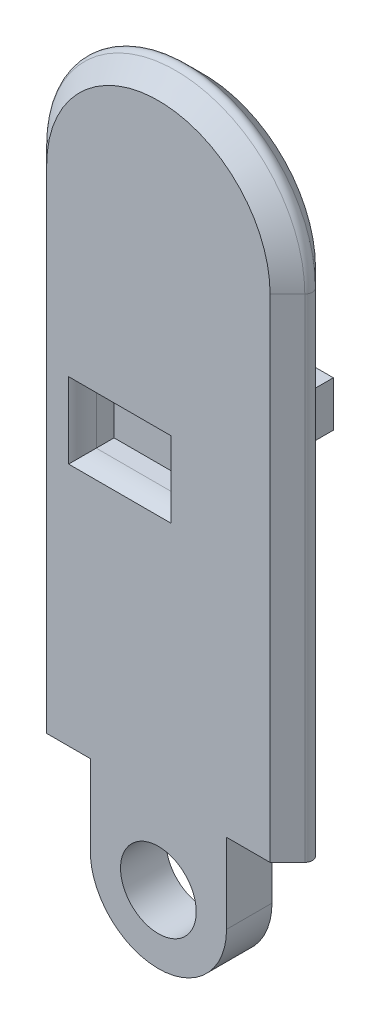
ISO-10303-21;
HEADER;
FILE_DESCRIPTION(('STEP AP214'),'2;1');
FILE_NAME('part.step','',(''),(''),'','','');
FILE_SCHEMA(('AUTOMOTIVE_DESIGN { 1 0 10303 214 1 1 1 1 }'));
ENDSEC;
DATA;
#1=APPLICATION_CONTEXT('core data for automotive mechanical design processes');
#2=APPLICATION_PROTOCOL_DEFINITION('international standard','automotive_design',2000,#1);
#3=PRODUCT_CONTEXT('',#1,'mechanical');
#4=PRODUCT('Part','Part','',(#3));
#5=PRODUCT_RELATED_PRODUCT_CATEGORY('part','',(#4));
#6=PRODUCT_DEFINITION_FORMATION('','',#4);
#7=PRODUCT_DEFINITION_CONTEXT('part definition',#1,'design');
#8=PRODUCT_DEFINITION('design','',#6,#7);
#9=PRODUCT_DEFINITION_SHAPE('','',#8);
#10=(LENGTH_UNIT() NAMED_UNIT(*) SI_UNIT(.MILLI.,.METRE.));
#11=(NAMED_UNIT(*) PLANE_ANGLE_UNIT() SI_UNIT($,.RADIAN.));
#12=(NAMED_UNIT(*) SI_UNIT($,.STERADIAN.) SOLID_ANGLE_UNIT());
#13=UNCERTAINTY_MEASURE_WITH_UNIT(LENGTH_MEASURE(1.E-05),#10,'distance_accuracy_value','');
#14=(GEOMETRIC_REPRESENTATION_CONTEXT(3) GLOBAL_UNCERTAINTY_ASSIGNED_CONTEXT((#13)) GLOBAL_UNIT_ASSIGNED_CONTEXT((#10,
#11,#12)) REPRESENTATION_CONTEXT('',''));
#15=CARTESIAN_POINT('',(0.,0.,0.));
#16=DIRECTION('',(0.,0.,1.));
#17=DIRECTION('',(1.,0.,0.));
#18=AXIS2_PLACEMENT_3D('',#15,#16,#17);
#19=CARTESIAN_POINT('',(0.,0.,-6.));
#20=DIRECTION('',(0.,0.,1.));
#21=DIRECTION('',(1.,0.,0.));
#22=AXIS2_PLACEMENT_3D('',#19,#20,#21);
#23=PLANE('',#22);
#24=CARTESIAN_POINT('',(0.,-43.030823628885,-6.));
#25=DIRECTION('',(0.,0.,1.));
#26=DIRECTION('',(1.,0.,0.));
#27=AXIS2_PLACEMENT_3D('',#24,#25,#26);
#28=CIRCLE('',#27,5.);
#29=CARTESIAN_POINT('',(5.,-43.030823628885,-6.));
#30=VERTEX_POINT('',#29);
#31=EDGE_CURVE('E267',#30,#30,#28,.T.);
#32=ORIENTED_EDGE('',*,*,#31,.T.);
#33=EDGE_LOOP('',(#32));
#34=FACE_BOUND('',#33,.T.);
#35=CARTESIAN_POINT('',(0.,32.5,-6.));
#36=DIRECTION('',(0.,0.,1.));
#37=DIRECTION('',(1.,0.,0.));
#38=AXIS2_PLACEMENT_3D('',#35,#36,#37);
#39=CIRCLE('',#38,14.75);
#40=CARTESIAN_POINT('',(-14.75,32.5,-6.));
#41=VERTEX_POINT('',#40);
#42=CARTESIAN_POINT('',(14.75,32.5,-6.));
#43=VERTEX_POINT('',#42);
#44=EDGE_CURVE('E348',#41,#43,#39,.F.);
#45=ORIENTED_EDGE('',*,*,#44,.T.);
#46=DIRECTION('',(0.,-1.,0.));
#47=VECTOR('',#46,1.);
#48=CARTESIAN_POINT('',(14.75,0.,-6.));
#49=LINE('',#48,#47);
#50=CARTESIAN_POINT('',(14.75,-32.5,-6.));
#51=VERTEX_POINT('',#50);
#52=EDGE_CURVE('E350',#43,#51,#49,.T.);
#53=ORIENTED_EDGE('',*,*,#52,.T.);
#54=DIRECTION('',(1.,0.,0.));
#55=VECTOR('',#54,1.);
#56=CARTESIAN_POINT('',(0.,-32.5,-6.));
#57=LINE('',#56,#55);
#58=CARTESIAN_POINT('',(9.,-32.5,-6.));
#59=VERTEX_POINT('',#58);
#60=EDGE_CURVE('E342',#59,#51,#57,.T.);
#61=ORIENTED_EDGE('',*,*,#60,.F.);
#62=DIRECTION('',(0.,1.,0.));
#63=VECTOR('',#62,1.);
#64=CARTESIAN_POINT('',(8.99999999999999,0.,-6.));
#65=LINE('',#64,#63);
#66=CARTESIAN_POINT('',(9.00000000000001,-43.030823628885,-6.));
#67=VERTEX_POINT('',#66);
#68=EDGE_CURVE('E265',#67,#59,#65,.T.);
#69=ORIENTED_EDGE('',*,*,#68,.F.);
#70=CARTESIAN_POINT('',(0.,-43.030823628885,-6.));
#71=DIRECTION('',(0.,0.,1.));
#72=DIRECTION('',(1.,0.,0.));
#73=AXIS2_PLACEMENT_3D('',#70,#71,#72);
#74=CIRCLE('',#73,9.);
#75=CARTESIAN_POINT('',(-8.97468464942043,-43.7053867789735,-6.));
#76=VERTEX_POINT('',#75);
#77=EDGE_CURVE('E261',#76,#67,#74,.T.);
#78=ORIENTED_EDGE('',*,*,#77,.F.);
#79=DIRECTION('',(0.,-1.,0.));
#80=VECTOR('',#79,1.);
#81=CARTESIAN_POINT('',(-8.97468464942044,0.,-6.));
#82=LINE('',#81,#80);
#83=CARTESIAN_POINT('',(-8.97468464942043,-32.5,-6.));
#84=VERTEX_POINT('',#83);
#85=EDGE_CURVE('E258',#84,#76,#82,.T.);
#86=ORIENTED_EDGE('',*,*,#85,.F.);
#87=CARTESIAN_POINT('',(-14.75,-32.5,-6.));
#88=VERTEX_POINT('',#87);
#89=EDGE_CURVE('E338',#88,#84,#57,.T.);
#90=ORIENTED_EDGE('',*,*,#89,.F.);
#91=DIRECTION('',(0.,1.,0.));
#92=VECTOR('',#91,1.);
#93=CARTESIAN_POINT('',(-14.75,32.5,-6.));
#94=LINE('',#93,#92);
#95=EDGE_CURVE('E341',#88,#41,#94,.T.);
#96=ORIENTED_EDGE('',*,*,#95,.T.);
#97=EDGE_LOOP('',(#45,#53,#61,#69,#78,#86,#90,#96));
#98=FACE_BOUND('',#97,.T.);
#99=DIRECTION('',(0.,-1.,0.));
#100=VECTOR('',#99,1.);
#101=CARTESIAN_POINT('',(0.499999999999989,-30.4,-6.));
#102=LINE('',#101,#100);
#103=CARTESIAN_POINT('',(0.499999999999989,-23.4,-6.));
#104=VERTEX_POINT('',#103);
#105=CARTESIAN_POINT('',(0.499999999999989,-30.4,-6.));
#106=VERTEX_POINT('',#105);
#107=EDGE_CURVE('E302',#104,#106,#102,.T.);
#108=ORIENTED_EDGE('',*,*,#107,.F.);
#109=DIRECTION('',(-1.,0.,0.));
#110=VECTOR('',#109,1.);
#111=CARTESIAN_POINT('',(0.,-23.4,-6.));
#112=LINE('',#111,#110);
#113=CARTESIAN_POINT('',(-8.50000000000001,-23.4,-6.));
#114=VERTEX_POINT('',#113);
#115=EDGE_CURVE('E407',#104,#114,#112,.T.);
#116=ORIENTED_EDGE('',*,*,#115,.T.);
#117=DIRECTION('',(0.,1.,0.));
#118=VECTOR('',#117,1.);
#119=CARTESIAN_POINT('',(-8.50000000000001,-30.4,-6.));
#120=LINE('',#119,#118);
#121=CARTESIAN_POINT('',(-8.50000000000001,-30.4,-6.));
#122=VERTEX_POINT('',#121);
#123=EDGE_CURVE('E280',#122,#114,#120,.T.);
#124=ORIENTED_EDGE('',*,*,#123,.F.);
#125=DIRECTION('',(-1.,0.,0.));
#126=VECTOR('',#125,1.);
#127=CARTESIAN_POINT('',(0.499999999999989,-30.4,-6.));
#128=LINE('',#127,#126);
#129=EDGE_CURVE('E291',#106,#122,#128,.T.);
#130=ORIENTED_EDGE('',*,*,#129,.F.);
#131=EDGE_LOOP('',(#108,#116,#124,#130));
#132=FACE_BOUND('',#131,.T.);
#133=DIRECTION('',(1.,0.,0.));
#134=VECTOR('',#133,1.);
#135=CARTESIAN_POINT('',(0.,16.6,-6.));
#136=LINE('',#135,#134);
#137=CARTESIAN_POINT('',(8.39999999999998,16.6,-6.));
#138=VERTEX_POINT('',#137);
#139=CARTESIAN_POINT('',(12.6,16.6,-6.));
#140=VERTEX_POINT('',#139);
#141=EDGE_CURVE('E247',#138,#140,#136,.T.);
#142=ORIENTED_EDGE('',*,*,#141,.F.);
#143=DIRECTION('',(0.,-1.,0.));
#144=VECTOR('',#143,1.);
#145=CARTESIAN_POINT('',(8.39999999999998,0.,-6.));
#146=LINE('',#145,#144);
#147=CARTESIAN_POINT('',(8.39999999999998,10.6,-6.));
#148=VERTEX_POINT('',#147);
#149=EDGE_CURVE('E243',#138,#148,#146,.T.);
#150=ORIENTED_EDGE('',*,*,#149,.T.);
#151=DIRECTION('',(1.,0.,0.));
#152=VECTOR('',#151,1.);
#153=CARTESIAN_POINT('',(0.,10.6,-6.));
#154=LINE('',#153,#152);
#155=CARTESIAN_POINT('',(12.6,10.6,-6.));
#156=VERTEX_POINT('',#155);
#157=EDGE_CURVE('E445',#148,#156,#154,.T.);
#158=ORIENTED_EDGE('',*,*,#157,.T.);
#159=DIRECTION('',(0.,-1.,0.));
#160=VECTOR('',#159,1.);
#161=CARTESIAN_POINT('',(12.6,0.,-6.));
#162=LINE('',#161,#160);
#163=EDGE_CURVE('E443',#140,#156,#162,.T.);
#164=ORIENTED_EDGE('',*,*,#163,.F.);
#165=EDGE_LOOP('',(#142,#150,#158,#164));
#166=FACE_BOUND('',#165,.T.);
#167=ADVANCED_FACE('F45',(#34,#98,#132,#166),#23,.F.);
#168=CARTESIAN_POINT('',(0.,-32.5,-6.));
#169=DIRECTION('',(0.,-1.,0.));
#170=DIRECTION('',(0.,0.,-1.));
#171=AXIS2_PLACEMENT_3D('',#168,#169,#170);
#172=PLANE('',#171);
#173=ORIENTED_EDGE('',*,*,#89,.T.);
#174=DIRECTION('',(0.,0.,1.));
#175=VECTOR('',#174,1.);
#176=CARTESIAN_POINT('',(-8.97468464942043,-32.5,-6.));
#177=LINE('',#176,#175);
#178=CARTESIAN_POINT('',(-8.97468464942043,-32.5,0.));
#179=VERTEX_POINT('',#178);
#180=EDGE_CURVE('E269',#84,#179,#177,.T.);
#181=ORIENTED_EDGE('',*,*,#180,.T.);
#182=DIRECTION('',(1.,0.,0.));
#183=VECTOR('',#182,1.);
#184=CARTESIAN_POINT('',(0.,-32.5,0.));
#185=LINE('',#184,#183);
#186=CARTESIAN_POINT('',(-14.75,-32.5,0.));
#187=VERTEX_POINT('',#186);
#188=EDGE_CURVE('E343',#187,#179,#185,.T.);
#189=ORIENTED_EDGE('',*,*,#188,.F.);
#190=DIRECTION('',(0.707106781186546,0.,0.707106781186549));
#191=VECTOR('',#190,1.);
#192=CARTESIAN_POINT('',(-10.375,-32.5,4.37499999999998));
#193=LINE('',#192,#191);
#194=CARTESIAN_POINT('',(-17.0428932188134,-32.5,-2.29289321881346));
#195=VERTEX_POINT('',#194);
#196=EDGE_CURVE('E353',#187,#195,#193,.F.);
#197=ORIENTED_EDGE('',*,*,#196,.T.);
#198=CARTESIAN_POINT('',(-16.3357864376269,-32.5,-3.));
#199=DIRECTION('',(0.,-1.,0.));
#200=DIRECTION('',(0.,0.,-1.));
#201=AXIS2_PLACEMENT_3D('',#198,#199,#200);
#202=CIRCLE('',#201,1.);
#203=CARTESIAN_POINT('',(-17.0428932188134,-32.5,-3.70710678118655));
#204=VERTEX_POINT('',#203);
#205=EDGE_CURVE('E386',#195,#204,#202,.T.);
#206=ORIENTED_EDGE('',*,*,#205,.T.);
#207=DIRECTION('',(0.707106781186549,0.,-0.707106781186546));
#208=VECTOR('',#207,1.);
#209=CARTESIAN_POINT('',(-7.37499999999996,-32.5,-13.375));
#210=LINE('',#209,#208);
#211=EDGE_CURVE('E356',#204,#88,#210,.T.);
#212=ORIENTED_EDGE('',*,*,#211,.T.);
#213=EDGE_LOOP('',(#173,#181,#189,#197,#206,#212));
#214=FACE_BOUND('',#213,.T.);
#215=ADVANCED_FACE('F471',(#214),#172,.T.);
#216=DIRECTION('',(0.,0.,1.));
#217=VECTOR('',#216,1.);
#218=CARTESIAN_POINT('',(9.,-32.5,-6.));
#219=LINE('',#218,#217);
#220=CARTESIAN_POINT('',(9.,-32.5,0.));
#221=VERTEX_POINT('',#220);
#222=EDGE_CURVE('E278',#59,#221,#219,.T.);
#223=ORIENTED_EDGE('',*,*,#222,.F.);
#224=ORIENTED_EDGE('',*,*,#60,.T.);
#225=DIRECTION('',(-0.707106781186549,0.,-0.707106781186546));
#226=VECTOR('',#225,1.);
#227=CARTESIAN_POINT('',(7.37499999999996,-32.5,-13.375));
#228=LINE('',#227,#226);
#229=CARTESIAN_POINT('',(17.0428932188134,-32.5,-3.70710678118656));
#230=VERTEX_POINT('',#229);
#231=EDGE_CURVE('E361',#51,#230,#228,.F.);
#232=ORIENTED_EDGE('',*,*,#231,.T.);
#233=CARTESIAN_POINT('',(16.3357864376269,-32.5,-3.));
#234=DIRECTION('',(0.,-1.,0.));
#235=DIRECTION('',(0.,0.,-1.));
#236=AXIS2_PLACEMENT_3D('',#233,#234,#235);
#237=CIRCLE('',#236,1.);
#238=CARTESIAN_POINT('',(17.0428932188135,-32.5,-2.29289321881346));
#239=VERTEX_POINT('',#238);
#240=EDGE_CURVE('E388',#230,#239,#237,.T.);
#241=ORIENTED_EDGE('',*,*,#240,.T.);
#242=DIRECTION('',(-0.707106781186546,0.,0.707106781186549));
#243=VECTOR('',#242,1.);
#244=CARTESIAN_POINT('',(10.375,-32.5,4.37499999999999));
#245=LINE('',#244,#243);
#246=CARTESIAN_POINT('',(14.75,-32.5,0.));
#247=VERTEX_POINT('',#246);
#248=EDGE_CURVE('E358',#239,#247,#245,.T.);
#249=ORIENTED_EDGE('',*,*,#248,.T.);
#250=EDGE_CURVE('E346',#221,#247,#185,.T.);
#251=ORIENTED_EDGE('',*,*,#250,.F.);
#252=EDGE_LOOP('',(#223,#224,#232,#241,#249,#251));
#253=FACE_BOUND('',#252,.T.);
#254=ADVANCED_FACE('F479',(#253),#172,.T.);
#255=CARTESIAN_POINT('',(0.,0.,0.));
#256=DIRECTION('',(0.,0.,1.));
#257=DIRECTION('',(1.,0.,0.));
#258=AXIS2_PLACEMENT_3D('',#255,#256,#257);
#259=PLANE('',#258);
#260=DIRECTION('',(-1.,0.,0.));
#261=VECTOR('',#260,1.);
#262=CARTESIAN_POINT('',(-10.85,-0.250000000000068,0.));
#263=LINE('',#262,#261);
#264=CARTESIAN_POINT('',(1.64999999999998,-0.250000000000068,0.));
#265=VERTEX_POINT('',#264);
#266=CARTESIAN_POINT('',(-11.85,-0.250000000000068,0.));
#267=VERTEX_POINT('',#266);
#268=EDGE_CURVE('E415',#265,#267,#263,.T.);
#269=ORIENTED_EDGE('',*,*,#268,.T.);
#270=DIRECTION('',(0.,1.,0.));
#271=VECTOR('',#270,1.);
#272=CARTESIAN_POINT('',(-11.85,8.74999999999992,0.));
#273=LINE('',#272,#271);
#274=CARTESIAN_POINT('',(-11.85,9.74999999999991,0.));
#275=VERTEX_POINT('',#274);
#276=EDGE_CURVE('E421',#267,#275,#273,.T.);
#277=ORIENTED_EDGE('',*,*,#276,.T.);
#278=DIRECTION('',(1.,0.,0.));
#279=VECTOR('',#278,1.);
#280=CARTESIAN_POINT('',(0.649999999999991,9.74999999999991,0.));
#281=LINE('',#280,#279);
#282=CARTESIAN_POINT('',(1.64999999999998,9.74999999999991,0.));
#283=VERTEX_POINT('',#282);
#284=EDGE_CURVE('E419',#275,#283,#281,.T.);
#285=ORIENTED_EDGE('',*,*,#284,.T.);
#286=DIRECTION('',(0.,-1.,0.));
#287=VECTOR('',#286,1.);
#288=CARTESIAN_POINT('',(1.64999999999998,0.74999999999992,0.));
#289=LINE('',#288,#287);
#290=EDGE_CURVE('E417',#283,#265,#289,.T.);
#291=ORIENTED_EDGE('',*,*,#290,.T.);
#292=EDGE_LOOP('',(#269,#277,#285,#291));
#293=FACE_BOUND('',#292,.T.);
#294=ORIENTED_EDGE('',*,*,#188,.T.);
#295=DIRECTION('',(0.,-1.,0.));
#296=VECTOR('',#295,1.);
#297=CARTESIAN_POINT('',(-8.97468464942044,0.,0.));
#298=LINE('',#297,#296);
#299=CARTESIAN_POINT('',(-8.97468464942043,-43.7053867789735,0.));
#300=VERTEX_POINT('',#299);
#301=EDGE_CURVE('E249',#179,#300,#298,.T.);
#302=ORIENTED_EDGE('',*,*,#301,.T.);
#303=CARTESIAN_POINT('',(0.,-43.030823628885,0.));
#304=DIRECTION('',(0.,0.,1.));
#305=DIRECTION('',(1.,0.,0.));
#306=AXIS2_PLACEMENT_3D('',#303,#304,#305);
#307=CIRCLE('',#306,9.);
#308=CARTESIAN_POINT('',(9.00000000000001,-43.030823628885,0.));
#309=VERTEX_POINT('',#308);
#310=EDGE_CURVE('E252',#300,#309,#307,.T.);
#311=ORIENTED_EDGE('',*,*,#310,.T.);
#312=DIRECTION('',(0.,1.,0.));
#313=VECTOR('',#312,1.);
#314=CARTESIAN_POINT('',(8.99999999999999,0.,0.));
#315=LINE('',#314,#313);
#316=EDGE_CURVE('E273',#309,#221,#315,.T.);
#317=ORIENTED_EDGE('',*,*,#316,.T.);
#318=ORIENTED_EDGE('',*,*,#250,.T.);
#319=DIRECTION('',(0.,1.,0.));
#320=VECTOR('',#319,1.);
#321=CARTESIAN_POINT('',(14.75,32.5,0.));
#322=LINE('',#321,#320);
#323=CARTESIAN_POINT('',(14.75,32.5,0.));
#324=VERTEX_POINT('',#323);
#325=EDGE_CURVE('E369',#247,#324,#322,.T.);
#326=ORIENTED_EDGE('',*,*,#325,.T.);
#327=CARTESIAN_POINT('',(0.,32.5,0.));
#328=DIRECTION('',(0.,0.,1.));
#329=DIRECTION('',(1.,0.,0.));
#330=AXIS2_PLACEMENT_3D('',#327,#328,#329);
#331=CIRCLE('',#330,14.75);
#332=CARTESIAN_POINT('',(-14.75,32.5,0.));
#333=VERTEX_POINT('',#332);
#334=EDGE_CURVE('E366',#324,#333,#331,.T.);
#335=ORIENTED_EDGE('',*,*,#334,.T.);
#336=DIRECTION('',(0.,-1.,0.));
#337=VECTOR('',#336,1.);
#338=CARTESIAN_POINT('',(-14.75,0.,0.));
#339=LINE('',#338,#337);
#340=EDGE_CURVE('E364',#333,#187,#339,.T.);
#341=ORIENTED_EDGE('',*,*,#340,.T.);
#342=EDGE_LOOP('',(#294,#302,#311,#317,#318,#326,#335,#341));
#343=FACE_BOUND('',#342,.T.);
#344=CARTESIAN_POINT('',(0.,-43.030823628885,0.));
#345=DIRECTION('',(0.,0.,1.));
#346=DIRECTION('',(1.,0.,0.));
#347=AXIS2_PLACEMENT_3D('',#344,#345,#346);
#348=CIRCLE('',#347,5.);
#349=CARTESIAN_POINT('',(5.,-43.030823628885,0.));
#350=VERTEX_POINT('',#349);
#351=EDGE_CURVE('E262',#350,#350,#348,.T.);
#352=ORIENTED_EDGE('',*,*,#351,.F.);
#353=EDGE_LOOP('',(#352));
#354=FACE_BOUND('',#353,.T.);
#355=ADVANCED_FACE('F487',(#293,#343,#354),#259,.T.);
#356=CARTESIAN_POINT('',(-14.75,0.,0.));
#357=DIRECTION('',(0.707106781186549,0.,-0.707106781186546));
#358=DIRECTION('',(0.,-1.,0.));
#359=AXIS2_PLACEMENT_3D('',#356,#357,#358);
#360=PLANE('',#359);
#361=DIRECTION('',(0.707106781186546,0.,0.707106781186549));
#362=VECTOR('',#361,1.);
#363=CARTESIAN_POINT('',(-17.75,32.5,-3.00000000000002));
#364=LINE('',#363,#362);
#365=CARTESIAN_POINT('',(-17.0428932188134,32.5,-2.29289321881346));
#366=VERTEX_POINT('',#365);
#367=EDGE_CURVE('E382',#366,#333,#364,.T.);
#368=ORIENTED_EDGE('',*,*,#367,.F.);
#369=DIRECTION('',(0.,1.,0.));
#370=VECTOR('',#369,1.);
#371=CARTESIAN_POINT('',(-17.0428932188134,0.,-2.29289321881346));
#372=LINE('',#371,#370);
#373=EDGE_CURVE('E398',#366,#195,#372,.F.);
#374=ORIENTED_EDGE('',*,*,#373,.T.);
#375=ORIENTED_EDGE('',*,*,#196,.F.);
#376=ORIENTED_EDGE('',*,*,#340,.F.);
#377=EDGE_LOOP('',(#368,#374,#375,#376));
#378=FACE_BOUND('',#377,.T.);
#379=ADVANCED_FACE('F489',(#378),#360,.F.);
#380=CARTESIAN_POINT('',(0.,32.5,0.));
#381=DIRECTION('',(0.,0.,-1.));
#382=DIRECTION('',(-1.,0.,0.));
#383=AXIS2_PLACEMENT_3D('',#380,#381,#382);
#384=CONICAL_SURFACE('',#383,14.75,0.785398163397446);
#385=DIRECTION('',(-0.707106781186546,0.,0.707106781186549));
#386=VECTOR('',#385,1.);
#387=CARTESIAN_POINT('',(17.75,32.5,-3.00000000000002));
#388=LINE('',#387,#386);
#389=CARTESIAN_POINT('',(17.0428932188135,32.5,-2.29289321881346));
#390=VERTEX_POINT('',#389);
#391=EDGE_CURVE('E380',#390,#324,#388,.T.);
#392=ORIENTED_EDGE('',*,*,#391,.F.);
#393=CARTESIAN_POINT('',(0.,32.5,-2.29289321881346));
#394=DIRECTION('',(0.,0.,1.));
#395=DIRECTION('',(1.,0.,0.));
#396=AXIS2_PLACEMENT_3D('',#393,#394,#395);
#397=CIRCLE('',#396,17.0428932188135);
#398=EDGE_CURVE('E394',#390,#366,#397,.T.);
#399=ORIENTED_EDGE('',*,*,#398,.T.);
#400=ORIENTED_EDGE('',*,*,#367,.T.);
#401=ORIENTED_EDGE('',*,*,#334,.F.);
#402=EDGE_LOOP('',(#392,#399,#400,#401));
#403=FACE_BOUND('',#402,.T.);
#404=ADVANCED_FACE('F524',(#403),#384,.T.);
#405=CARTESIAN_POINT('',(-17.75,0.,-3.));
#406=DIRECTION('',(-0.707106781186546,0.,-0.707106781186549));
#407=DIRECTION('',(0.,1.,0.));
#408=AXIS2_PLACEMENT_3D('',#405,#406,#407);
#409=PLANE('',#408);
#410=ORIENTED_EDGE('',*,*,#211,.F.);
#411=DIRECTION('',(0.,-1.,0.));
#412=VECTOR('',#411,1.);
#413=CARTESIAN_POINT('',(-17.0428932188134,0.,-3.70710678118655));
#414=LINE('',#413,#412);
#415=CARTESIAN_POINT('',(-17.0428932188134,32.5,-3.70710678118655));
#416=VERTEX_POINT('',#415);
#417=EDGE_CURVE('E396',#204,#416,#414,.F.);
#418=ORIENTED_EDGE('',*,*,#417,.T.);
#419=DIRECTION('',(-0.707106781186549,0.,0.707106781186546));
#420=VECTOR('',#419,1.);
#421=CARTESIAN_POINT('',(-14.75,32.5,-6.));
#422=LINE('',#421,#420);
#423=EDGE_CURVE('E376',#41,#416,#422,.T.);
#424=ORIENTED_EDGE('',*,*,#423,.F.);
#425=ORIENTED_EDGE('',*,*,#95,.F.);
#426=EDGE_LOOP('',(#410,#418,#424,#425));
#427=FACE_BOUND('',#426,.T.);
#428=ADVANCED_FACE('F517',(#427),#409,.T.);
#429=CARTESIAN_POINT('',(17.75,0.,-3.00000000000002));
#430=DIRECTION('',(0.707106781186549,0.,0.707106781186546));
#431=DIRECTION('',(0.,1.,0.));
#432=AXIS2_PLACEMENT_3D('',#429,#430,#431);
#433=PLANE('',#432);
#434=ORIENTED_EDGE('',*,*,#248,.F.);
#435=DIRECTION('',(0.,1.,0.));
#436=VECTOR('',#435,1.);
#437=CARTESIAN_POINT('',(17.0428932188134,0.,-2.29289321881346));
#438=LINE('',#437,#436);
#439=EDGE_CURVE('E390',#239,#390,#438,.T.);
#440=ORIENTED_EDGE('',*,*,#439,.T.);
#441=ORIENTED_EDGE('',*,*,#391,.T.);
#442=ORIENTED_EDGE('',*,*,#325,.F.);
#443=EDGE_LOOP('',(#434,#440,#441,#442));
#444=FACE_BOUND('',#443,.T.);
#445=ADVANCED_FACE('F510',(#444),#433,.T.);
#446=CARTESIAN_POINT('',(0.,32.5,-3.));
#447=DIRECTION('',(0.,0.,1.));
#448=DIRECTION('',(1.,0.,0.));
#449=AXIS2_PLACEMENT_3D('',#446,#447,#448);
#450=CONICAL_SURFACE('',#449,17.75,0.785398163397451);
#451=ORIENTED_EDGE('',*,*,#423,.T.);
#452=CARTESIAN_POINT('',(0.,32.5,-3.70710678118655));
#453=DIRECTION('',(0.,0.,-1.));
#454=DIRECTION('',(-1.,0.,0.));
#455=AXIS2_PLACEMENT_3D('',#452,#453,#454);
#456=CIRCLE('',#455,17.0428932188134);
#457=CARTESIAN_POINT('',(17.0428932188134,32.5,-3.70710678118655));
#458=VERTEX_POINT('',#457);
#459=EDGE_CURVE('E392',#416,#458,#456,.T.);
#460=ORIENTED_EDGE('',*,*,#459,.T.);
#461=DIRECTION('',(0.707106781186549,0.,0.707106781186546));
#462=VECTOR('',#461,1.);
#463=CARTESIAN_POINT('',(14.75,32.5,-6.));
#464=LINE('',#463,#462);
#465=EDGE_CURVE('E373',#43,#458,#464,.T.);
#466=ORIENTED_EDGE('',*,*,#465,.F.);
#467=ORIENTED_EDGE('',*,*,#44,.F.);
#468=EDGE_LOOP('',(#451,#460,#466,#467));
#469=FACE_BOUND('',#468,.T.);
#470=ADVANCED_FACE('F503',(#469),#450,.T.);
#471=CARTESIAN_POINT('',(14.75,0.,-6.));
#472=DIRECTION('',(-0.707106781186546,0.,0.707106781186549));
#473=DIRECTION('',(0.,-1.,0.));
#474=AXIS2_PLACEMENT_3D('',#471,#472,#473);
#475=PLANE('',#474);
#476=ORIENTED_EDGE('',*,*,#465,.T.);
#477=DIRECTION('',(0.,-1.,0.));
#478=VECTOR('',#477,1.);
#479=CARTESIAN_POINT('',(17.0428932188134,0.,-3.70710678118655));
#480=LINE('',#479,#478);
#481=EDGE_CURVE('E372',#458,#230,#480,.T.);
#482=ORIENTED_EDGE('',*,*,#481,.T.);
#483=ORIENTED_EDGE('',*,*,#231,.F.);
#484=ORIENTED_EDGE('',*,*,#52,.F.);
#485=EDGE_LOOP('',(#476,#482,#483,#484));
#486=FACE_BOUND('',#485,.T.);
#487=ADVANCED_FACE('F495',(#486),#475,.F.);
#488=CARTESIAN_POINT('',(-16.3357864376269,0.,-3.));
#489=DIRECTION('',(0.,-1.,0.));
#490=DIRECTION('',(1.,0.,0.));
#491=AXIS2_PLACEMENT_3D('',#488,#489,#490);
#492=CYLINDRICAL_SURFACE('',#491,1.);
#493=ORIENTED_EDGE('',*,*,#205,.F.);
#494=ORIENTED_EDGE('',*,*,#373,.F.);
#495=CARTESIAN_POINT('',(-16.3357864376269,32.5,-3.));
#496=DIRECTION('',(0.,1.,0.));
#497=DIRECTION('',(0.,0.,1.));
#498=AXIS2_PLACEMENT_3D('',#495,#496,#497);
#499=CIRCLE('',#498,1.);
#500=EDGE_CURVE('E377',#416,#366,#499,.T.);
#501=ORIENTED_EDGE('',*,*,#500,.F.);
#502=ORIENTED_EDGE('',*,*,#417,.F.);
#503=EDGE_LOOP('',(#493,#494,#501,#502));
#504=FACE_BOUND('',#503,.T.);
#505=ADVANCED_FACE('F502',(#504),#492,.T.);
#506=CARTESIAN_POINT('',(0.,32.5,-3.00000000000001));
#507=DIRECTION('',(0.,0.,1.));
#508=DIRECTION('',(1.,0.,0.));
#509=AXIS2_PLACEMENT_3D('',#506,#507,#508);
#510=TOROIDAL_SURFACE('',#509,16.3357864376269,1.);
#511=ORIENTED_EDGE('',*,*,#500,.T.);
#512=ORIENTED_EDGE('',*,*,#398,.F.);
#513=CARTESIAN_POINT('',(16.3357864376269,32.5,-3.));
#514=DIRECTION('',(0.,-1.,0.));
#515=DIRECTION('',(0.,0.,-1.));
#516=AXIS2_PLACEMENT_3D('',#513,#514,#515);
#517=CIRCLE('',#516,1.);
#518=EDGE_CURVE('E332',#458,#390,#517,.T.);
#519=ORIENTED_EDGE('',*,*,#518,.F.);
#520=ORIENTED_EDGE('',*,*,#459,.F.);
#521=EDGE_LOOP('',(#511,#512,#519,#520));
#522=FACE_BOUND('',#521,.T.);
#523=ADVANCED_FACE('F540',(#522),#510,.T.);
#524=CARTESIAN_POINT('',(16.3357864376269,0.,-3.));
#525=DIRECTION('',(0.,1.,0.));
#526=DIRECTION('',(-1.,0.,0.));
#527=AXIS2_PLACEMENT_3D('',#524,#525,#526);
#528=CYLINDRICAL_SURFACE('',#527,1.);
#529=ORIENTED_EDGE('',*,*,#518,.T.);
#530=ORIENTED_EDGE('',*,*,#439,.F.);
#531=ORIENTED_EDGE('',*,*,#240,.F.);
#532=ORIENTED_EDGE('',*,*,#481,.F.);
#533=EDGE_LOOP('',(#529,#530,#531,#532));
#534=FACE_BOUND('',#533,.T.);
#535=ADVANCED_FACE('F537',(#534),#528,.T.);
#536=CARTESIAN_POINT('',(-10.85,8.74999999999992,-5.));
#537=DIRECTION('',(-1.,0.,0.));
#538=DIRECTION('',(0.,0.,1.));
#539=AXIS2_PLACEMENT_3D('',#536,#537,#538);
#540=PLANE('',#539);
#541=DIRECTION('',(0.,0.,1.));
#542=VECTOR('',#541,1.);
#543=CARTESIAN_POINT('',(-10.85,8.74999999999992,-5.));
#544=LINE('',#543,#542);
#545=CARTESIAN_POINT('',(-10.85,8.74999999999992,-5.));
#546=VERTEX_POINT('',#545);
#547=CARTESIAN_POINT('',(-10.85,8.74999999999992,-2.64575131106458));
#548=VERTEX_POINT('',#547);
#549=EDGE_CURVE('E329',#546,#548,#544,.T.);
#550=ORIENTED_EDGE('',*,*,#549,.T.);
#551=DIRECTION('',(0.,-1.,0.));
#552=VECTOR('',#551,1.);
#553=CARTESIAN_POINT('',(-10.85,8.74999999999992,-2.64575131106458));
#554=LINE('',#553,#552);
#555=CARTESIAN_POINT('',(-10.85,0.749999999999919,-2.64575131106458));
#556=VERTEX_POINT('',#555);
#557=EDGE_CURVE('E424',#548,#556,#554,.T.);
#558=ORIENTED_EDGE('',*,*,#557,.T.);
#559=DIRECTION('',(0.,0.,1.));
#560=VECTOR('',#559,1.);
#561=CARTESIAN_POINT('',(-10.85,0.749999999999919,-5.));
#562=LINE('',#561,#560);
#563=CARTESIAN_POINT('',(-10.85,0.749999999999919,-5.));
#564=VERTEX_POINT('',#563);
#565=EDGE_CURVE('E328',#564,#556,#562,.T.);
#566=ORIENTED_EDGE('',*,*,#565,.F.);
#567=DIRECTION('',(0.,-1.,0.));
#568=VECTOR('',#567,1.);
#569=CARTESIAN_POINT('',(-10.85,8.74999999999992,-5.));
#570=LINE('',#569,#568);
#571=EDGE_CURVE('E309',#546,#564,#570,.T.);
#572=ORIENTED_EDGE('',*,*,#571,.F.);
#573=EDGE_LOOP('',(#550,#558,#566,#572));
#574=FACE_BOUND('',#573,.T.);
#575=ADVANCED_FACE('F485',(#574),#540,.F.);
#576=CARTESIAN_POINT('',(0.649999999999991,8.74999999999992,-5.));
#577=DIRECTION('',(0.,1.,0.));
#578=DIRECTION('',(0.,0.,1.));
#579=AXIS2_PLACEMENT_3D('',#576,#577,#578);
#580=PLANE('',#579);
#581=DIRECTION('',(0.,0.,1.));
#582=VECTOR('',#581,1.);
#583=CARTESIAN_POINT('',(0.649999999999991,8.74999999999992,-5.));
#584=LINE('',#583,#582);
#585=CARTESIAN_POINT('',(0.649999999999991,8.74999999999992,-5.));
#586=VERTEX_POINT('',#585);
#587=CARTESIAN_POINT('',(0.649999999999991,8.74999999999992,-2.64575131106458));
#588=VERTEX_POINT('',#587);
#589=EDGE_CURVE('E333',#586,#588,#584,.T.);
#590=ORIENTED_EDGE('',*,*,#589,.T.);
#591=DIRECTION('',(-1.,0.,0.));
#592=VECTOR('',#591,1.);
#593=CARTESIAN_POINT('',(0.649999999999991,8.74999999999992,-2.64575131106458));
#594=LINE('',#593,#592);
#595=EDGE_CURVE('E427',#588,#548,#594,.T.);
#596=ORIENTED_EDGE('',*,*,#595,.T.);
#597=ORIENTED_EDGE('',*,*,#549,.F.);
#598=DIRECTION('',(-1.,0.,0.));
#599=VECTOR('',#598,1.);
#600=CARTESIAN_POINT('',(0.649999999999991,8.74999999999992,-5.));
#601=LINE('',#600,#599);
#602=EDGE_CURVE('E325',#586,#546,#601,.T.);
#603=ORIENTED_EDGE('',*,*,#602,.F.);
#604=EDGE_LOOP('',(#590,#596,#597,#603));
#605=FACE_BOUND('',#604,.T.);
#606=ADVANCED_FACE('F580',(#605),#580,.F.);
#607=CARTESIAN_POINT('',(0.649999999999991,8.74999999999992,-5.));
#608=DIRECTION('',(1.,0.,0.));
#609=DIRECTION('',(0.,1.,0.));
#610=AXIS2_PLACEMENT_3D('',#607,#608,#609);
#611=PLANE('',#610);
#612=DIRECTION('',(0.,0.,1.));
#613=VECTOR('',#612,1.);
#614=CARTESIAN_POINT('',(0.649999999999994,0.749999999999919,-5.));
#615=LINE('',#614,#613);
#616=CARTESIAN_POINT('',(0.649999999999994,0.749999999999919,-5.));
#617=VERTEX_POINT('',#616);
#618=CARTESIAN_POINT('',(0.649999999999994,0.749999999999919,-2.64575131106458));
#619=VERTEX_POINT('',#618);
#620=EDGE_CURVE('E335',#617,#619,#615,.T.);
#621=ORIENTED_EDGE('',*,*,#620,.T.);
#622=DIRECTION('',(0.,1.,0.));
#623=VECTOR('',#622,1.);
#624=CARTESIAN_POINT('',(0.649999999999991,8.74999999999992,-2.64575131106458));
#625=LINE('',#624,#623);
#626=EDGE_CURVE('E54',#619,#588,#625,.T.);
#627=ORIENTED_EDGE('',*,*,#626,.T.);
#628=ORIENTED_EDGE('',*,*,#589,.F.);
#629=DIRECTION('',(0.,1.,0.));
#630=VECTOR('',#629,1.);
#631=CARTESIAN_POINT('',(0.649999999999991,8.74999999999992,-5.));
#632=LINE('',#631,#630);
#633=EDGE_CURVE('E322',#617,#586,#632,.T.);
#634=ORIENTED_EDGE('',*,*,#633,.F.);
#635=EDGE_LOOP('',(#621,#627,#628,#634));
#636=FACE_BOUND('',#635,.T.);
#637=ADVANCED_FACE('F588',(#636),#611,.F.);
#638=CARTESIAN_POINT('',(0.649999999999994,0.749999999999919,-5.));
#639=DIRECTION('',(0.,-1.,0.));
#640=DIRECTION('',(0.,0.,-1.));
#641=AXIS2_PLACEMENT_3D('',#638,#639,#640);
#642=PLANE('',#641);
#643=ORIENTED_EDGE('',*,*,#565,.T.);
#644=DIRECTION('',(1.,0.,0.));
#645=VECTOR('',#644,1.);
#646=CARTESIAN_POINT('',(0.649999999999994,0.749999999999919,-2.64575131106458));
#647=LINE('',#646,#645);
#648=EDGE_CURVE('E11',#556,#619,#647,.T.);
#649=ORIENTED_EDGE('',*,*,#648,.T.);
#650=ORIENTED_EDGE('',*,*,#620,.F.);
#651=DIRECTION('',(1.,0.,0.));
#652=VECTOR('',#651,1.);
#653=CARTESIAN_POINT('',(0.649999999999994,0.749999999999919,-5.));
#654=LINE('',#653,#652);
#655=EDGE_CURVE('E319',#564,#617,#654,.T.);
#656=ORIENTED_EDGE('',*,*,#655,.F.);
#657=EDGE_LOOP('',(#643,#649,#650,#656));
#658=FACE_BOUND('',#657,.T.);
#659=ADVANCED_FACE('F589',(#658),#642,.F.);
#660=CARTESIAN_POINT('',(0.,0.,-5.));
#661=DIRECTION('',(0.,0.,-1.));
#662=DIRECTION('',(-1.,0.,0.));
#663=AXIS2_PLACEMENT_3D('',#660,#661,#662);
#664=PLANE('',#663);
#665=ORIENTED_EDGE('',*,*,#571,.T.);
#666=ORIENTED_EDGE('',*,*,#655,.T.);
#667=ORIENTED_EDGE('',*,*,#633,.T.);
#668=ORIENTED_EDGE('',*,*,#602,.T.);
#669=EDGE_LOOP('',(#665,#666,#667,#668));
#670=FACE_BOUND('',#669,.T.);
#671=ADVANCED_FACE('F586',(#670),#664,.F.);
#672=CARTESIAN_POINT('',(-8.50000000000001,-30.4,-1.5));
#673=DIRECTION('',(-1.,0.,0.));
#674=DIRECTION('',(0.,0.,1.));
#675=AXIS2_PLACEMENT_3D('',#672,#673,#674);
#676=PLANE('',#675);
#677=ORIENTED_EDGE('',*,*,#123,.T.);
#678=DIRECTION('',(0.,0.707106781186548,-0.707106781186548));
#679=VECTOR('',#678,1.);
#680=CARTESIAN_POINT('',(-8.50000000000001,-29.15,-0.250000000000008));
#681=LINE('',#680,#679);
#682=CARTESIAN_POINT('',(-8.50000000000001,-23.9,-5.50000000000001));
#683=VERTEX_POINT('',#682);
#684=EDGE_CURVE('E413',#114,#683,#681,.F.);
#685=ORIENTED_EDGE('',*,*,#684,.T.);
#686=DIRECTION('',(0.,0.,-1.));
#687=VECTOR('',#686,1.);
#688=CARTESIAN_POINT('',(-8.50000000000001,-23.9,-1.5));
#689=LINE('',#688,#687);
#690=CARTESIAN_POINT('',(-8.50000000000001,-23.9,-1.5));
#691=VERTEX_POINT('',#690);
#692=EDGE_CURVE('E300',#691,#683,#689,.T.);
#693=ORIENTED_EDGE('',*,*,#692,.F.);
#694=DIRECTION('',(0.,1.,0.));
#695=VECTOR('',#694,1.);
#696=CARTESIAN_POINT('',(-8.50000000000001,-30.4,-1.5));
#697=LINE('',#696,#695);
#698=CARTESIAN_POINT('',(-8.50000000000001,-30.4,-1.5));
#699=VERTEX_POINT('',#698);
#700=EDGE_CURVE('E287',#699,#691,#697,.T.);
#701=ORIENTED_EDGE('',*,*,#700,.F.);
#702=DIRECTION('',(0.,0.,-1.));
#703=VECTOR('',#702,1.);
#704=CARTESIAN_POINT('',(-8.50000000000001,-30.4,-1.5));
#705=LINE('',#704,#703);
#706=EDGE_CURVE('E307',#699,#122,#705,.T.);
#707=ORIENTED_EDGE('',*,*,#706,.T.);
#708=EDGE_LOOP('',(#677,#685,#693,#701,#707));
#709=FACE_BOUND('',#708,.T.);
#710=ADVANCED_FACE('F594',(#709),#676,.F.);
#711=CARTESIAN_POINT('',(0.499999999999989,-30.4,-1.5));
#712=DIRECTION('',(0.,-1.,0.));
#713=DIRECTION('',(0.,0.,-1.));
#714=AXIS2_PLACEMENT_3D('',#711,#712,#713);
#715=PLANE('',#714);
#716=ORIENTED_EDGE('',*,*,#129,.T.);
#717=ORIENTED_EDGE('',*,*,#706,.F.);
#718=DIRECTION('',(-1.,0.,0.));
#719=VECTOR('',#718,1.);
#720=CARTESIAN_POINT('',(0.499999999999989,-30.4,-1.5));
#721=LINE('',#720,#719);
#722=CARTESIAN_POINT('',(0.499999999999989,-30.4,-1.5));
#723=VERTEX_POINT('',#722);
#724=EDGE_CURVE('E297',#723,#699,#721,.T.);
#725=ORIENTED_EDGE('',*,*,#724,.F.);
#726=DIRECTION('',(0.,0.,-1.));
#727=VECTOR('',#726,1.);
#728=CARTESIAN_POINT('',(0.499999999999989,-30.4,-1.5));
#729=LINE('',#728,#727);
#730=EDGE_CURVE('E310',#723,#106,#729,.T.);
#731=ORIENTED_EDGE('',*,*,#730,.T.);
#732=EDGE_LOOP('',(#716,#717,#725,#731));
#733=FACE_BOUND('',#732,.T.);
#734=ADVANCED_FACE('F602',(#733),#715,.F.);
#735=CARTESIAN_POINT('',(0.499999999999989,-30.4,-1.5));
#736=DIRECTION('',(1.,0.,0.));
#737=DIRECTION('',(0.,0.,-1.));
#738=AXIS2_PLACEMENT_3D('',#735,#736,#737);
#739=PLANE('',#738);
#740=ORIENTED_EDGE('',*,*,#107,.T.);
#741=ORIENTED_EDGE('',*,*,#730,.F.);
#742=DIRECTION('',(0.,-1.,0.));
#743=VECTOR('',#742,1.);
#744=CARTESIAN_POINT('',(0.499999999999989,-30.4,-1.5));
#745=LINE('',#744,#743);
#746=CARTESIAN_POINT('',(0.499999999999989,-23.9,-1.5));
#747=VERTEX_POINT('',#746);
#748=EDGE_CURVE('E294',#747,#723,#745,.T.);
#749=ORIENTED_EDGE('',*,*,#748,.F.);
#750=DIRECTION('',(0.,0.,-1.));
#751=VECTOR('',#750,1.);
#752=CARTESIAN_POINT('',(0.499999999999989,-23.9,-1.5));
#753=LINE('',#752,#751);
#754=CARTESIAN_POINT('',(0.499999999999989,-23.9,-5.50000000000001));
#755=VERTEX_POINT('',#754);
#756=EDGE_CURVE('E312',#747,#755,#753,.T.);
#757=ORIENTED_EDGE('',*,*,#756,.T.);
#758=DIRECTION('',(0.,-0.707106781186548,0.707106781186548));
#759=VECTOR('',#758,1.);
#760=CARTESIAN_POINT('',(0.499999999999989,-29.15,-0.250000000000008));
#761=LINE('',#760,#759);
#762=EDGE_CURVE('E410',#755,#104,#761,.F.);
#763=ORIENTED_EDGE('',*,*,#762,.T.);
#764=EDGE_LOOP('',(#740,#741,#749,#757,#763));
#765=FACE_BOUND('',#764,.T.);
#766=ADVANCED_FACE('F607',(#765),#739,.F.);
#767=CARTESIAN_POINT('',(0.499999999999989,-23.9,-1.5));
#768=DIRECTION('',(0.,1.,0.));
#769=DIRECTION('',(0.,0.,1.));
#770=AXIS2_PLACEMENT_3D('',#767,#768,#769);
#771=PLANE('',#770);
#772=ORIENTED_EDGE('',*,*,#692,.T.);
#773=DIRECTION('',(1.,0.,0.));
#774=VECTOR('',#773,1.);
#775=CARTESIAN_POINT('',(0.499999999999989,-23.9,-5.50000000000001));
#776=LINE('',#775,#774);
#777=EDGE_CURVE('E400',#683,#755,#776,.T.);
#778=ORIENTED_EDGE('',*,*,#777,.T.);
#779=ORIENTED_EDGE('',*,*,#756,.F.);
#780=DIRECTION('',(1.,0.,0.));
#781=VECTOR('',#780,1.);
#782=CARTESIAN_POINT('',(0.499999999999989,-23.9,-1.5));
#783=LINE('',#782,#781);
#784=EDGE_CURVE('E290',#691,#747,#783,.T.);
#785=ORIENTED_EDGE('',*,*,#784,.F.);
#786=EDGE_LOOP('',(#772,#778,#779,#785));
#787=FACE_BOUND('',#786,.T.);
#788=ADVANCED_FACE('F604',(#787),#771,.F.);
#789=CARTESIAN_POINT('',(0.,0.,-1.5));
#790=DIRECTION('',(0.,0.,1.));
#791=DIRECTION('',(1.,0.,0.));
#792=AXIS2_PLACEMENT_3D('',#789,#790,#791);
#793=PLANE('',#792);
#794=ORIENTED_EDGE('',*,*,#700,.T.);
#795=ORIENTED_EDGE('',*,*,#784,.T.);
#796=ORIENTED_EDGE('',*,*,#748,.T.);
#797=ORIENTED_EDGE('',*,*,#724,.T.);
#798=EDGE_LOOP('',(#794,#795,#796,#797));
#799=FACE_BOUND('',#798,.T.);
#800=ADVANCED_FACE('F554',(#799),#793,.F.);
#801=CARTESIAN_POINT('',(0.499999999999989,-23.9,-5.50000000000001));
#802=DIRECTION('',(0.,0.707106781186548,0.707106781186548));
#803=DIRECTION('',(1.,0.,0.));
#804=AXIS2_PLACEMENT_3D('',#801,#802,#803);
#805=PLANE('',#804);
#806=ORIENTED_EDGE('',*,*,#684,.F.);
#807=ORIENTED_EDGE('',*,*,#115,.F.);
#808=ORIENTED_EDGE('',*,*,#762,.F.);
#809=ORIENTED_EDGE('',*,*,#777,.F.);
#810=EDGE_LOOP('',(#806,#807,#808,#809));
#811=FACE_BOUND('',#810,.T.);
#812=ADVANCED_FACE('F548',(#811),#805,.F.);
#813=CARTESIAN_POINT('',(8.99999999999999,0.,-6.));
#814=DIRECTION('',(1.,0.,0.));
#815=DIRECTION('',(0.,1.,0.));
#816=AXIS2_PLACEMENT_3D('',#813,#814,#815);
#817=PLANE('',#816);
#818=ORIENTED_EDGE('',*,*,#316,.F.);
#819=DIRECTION('',(0.,0.,1.));
#820=VECTOR('',#819,1.);
#821=CARTESIAN_POINT('',(9.00000000000001,-43.030823628885,-6.));
#822=LINE('',#821,#820);
#823=EDGE_CURVE('E281',#67,#309,#822,.T.);
#824=ORIENTED_EDGE('',*,*,#823,.F.);
#825=ORIENTED_EDGE('',*,*,#68,.T.);
#826=ORIENTED_EDGE('',*,*,#222,.T.);
#827=EDGE_LOOP('',(#818,#824,#825,#826));
#828=FACE_BOUND('',#827,.T.);
#829=ADVANCED_FACE('F553',(#828),#817,.T.);
#830=CARTESIAN_POINT('',(0.,-43.030823628885,-6.));
#831=DIRECTION('',(0.,0.,1.));
#832=DIRECTION('',(1.,0.,0.));
#833=AXIS2_PLACEMENT_3D('',#830,#831,#832);
#834=CYLINDRICAL_SURFACE('',#833,9.);
#835=ORIENTED_EDGE('',*,*,#310,.F.);
#836=DIRECTION('',(0.,0.,1.));
#837=VECTOR('',#836,1.);
#838=CARTESIAN_POINT('',(-8.97468464942043,-43.7053867789735,-6.));
#839=LINE('',#838,#837);
#840=EDGE_CURVE('E283',#76,#300,#839,.T.);
#841=ORIENTED_EDGE('',*,*,#840,.F.);
#842=ORIENTED_EDGE('',*,*,#77,.T.);
#843=ORIENTED_EDGE('',*,*,#823,.T.);
#844=EDGE_LOOP('',(#835,#841,#842,#843));
#845=FACE_BOUND('',#844,.T.);
#846=ADVANCED_FACE('F622',(#845),#834,.T.);
#847=CARTESIAN_POINT('',(-8.97468464942044,0.,-6.));
#848=DIRECTION('',(-1.,0.,0.));
#849=DIRECTION('',(0.,-1.,0.));
#850=AXIS2_PLACEMENT_3D('',#847,#848,#849);
#851=PLANE('',#850);
#852=ORIENTED_EDGE('',*,*,#301,.F.);
#853=ORIENTED_EDGE('',*,*,#180,.F.);
#854=ORIENTED_EDGE('',*,*,#85,.T.);
#855=ORIENTED_EDGE('',*,*,#840,.T.);
#856=EDGE_LOOP('',(#852,#853,#854,#855));
#857=FACE_BOUND('',#856,.T.);
#858=ADVANCED_FACE('F618',(#857),#851,.T.);
#859=CARTESIAN_POINT('',(0.,-43.030823628885,-6.));
#860=DIRECTION('',(0.,0.,1.));
#861=DIRECTION('',(1.,0.,0.));
#862=AXIS2_PLACEMENT_3D('',#859,#860,#861);
#863=CYLINDRICAL_SURFACE('',#862,5.);
#864=ORIENTED_EDGE('',*,*,#31,.F.);
#865=EDGE_LOOP('',(#864));
#866=FACE_BOUND('',#865,.T.);
#867=ORIENTED_EDGE('',*,*,#351,.T.);
#868=EDGE_LOOP('',(#867));
#869=FACE_BOUND('',#868,.T.);
#870=ADVANCED_FACE('F621',(#866,#869),#863,.F.);
#871=CARTESIAN_POINT('',(0.,16.6,-10.5));
#872=DIRECTION('',(0.,-1.,0.));
#873=DIRECTION('',(0.,0.,-1.));
#874=AXIS2_PLACEMENT_3D('',#871,#872,#873);
#875=PLANE('',#874);
#876=ORIENTED_EDGE('',*,*,#141,.T.);
#877=DIRECTION('',(0.,0.,1.));
#878=VECTOR('',#877,1.);
#879=CARTESIAN_POINT('',(12.6,16.6,-10.5));
#880=LINE('',#879,#878);
#881=CARTESIAN_POINT('',(12.6,16.6,-10.5));
#882=VERTEX_POINT('',#881);
#883=EDGE_CURVE('E228',#882,#140,#880,.T.);
#884=ORIENTED_EDGE('',*,*,#883,.F.);
#885=DIRECTION('',(1.,0.,0.));
#886=VECTOR('',#885,1.);
#887=CARTESIAN_POINT('',(0.,16.6,-10.5));
#888=LINE('',#887,#886);
#889=CARTESIAN_POINT('',(8.39999999999998,16.6,-10.5));
#890=VERTEX_POINT('',#889);
#891=EDGE_CURVE('E235',#890,#882,#888,.T.);
#892=ORIENTED_EDGE('',*,*,#891,.F.);
#893=DIRECTION('',(0.,0.,1.));
#894=VECTOR('',#893,1.);
#895=CARTESIAN_POINT('',(8.39999999999998,16.6,-10.5));
#896=LINE('',#895,#894);
#897=EDGE_CURVE('E454',#890,#138,#896,.T.);
#898=ORIENTED_EDGE('',*,*,#897,.T.);
#899=EDGE_LOOP('',(#876,#884,#892,#898));
#900=FACE_BOUND('',#899,.T.);
#901=ADVANCED_FACE('F245',(#900),#875,.F.);
#902=CARTESIAN_POINT('',(12.6,0.,-10.5));
#903=DIRECTION('',(-1.,0.,0.));
#904=DIRECTION('',(0.,-1.,0.));
#905=AXIS2_PLACEMENT_3D('',#902,#903,#904);
#906=PLANE('',#905);
#907=ORIENTED_EDGE('',*,*,#163,.T.);
#908=DIRECTION('',(0.,0.,1.));
#909=VECTOR('',#908,1.);
#910=CARTESIAN_POINT('',(12.6,10.6,-10.5));
#911=LINE('',#910,#909);
#912=CARTESIAN_POINT('',(12.6,10.6,-10.5));
#913=VERTEX_POINT('',#912);
#914=EDGE_CURVE('E230',#913,#156,#911,.T.);
#915=ORIENTED_EDGE('',*,*,#914,.F.);
#916=DIRECTION('',(0.,-1.,0.));
#917=VECTOR('',#916,1.);
#918=CARTESIAN_POINT('',(12.6,0.,-10.5));
#919=LINE('',#918,#917);
#920=EDGE_CURVE('E223',#882,#913,#919,.T.);
#921=ORIENTED_EDGE('',*,*,#920,.F.);
#922=ORIENTED_EDGE('',*,*,#883,.T.);
#923=EDGE_LOOP('',(#907,#915,#921,#922));
#924=FACE_BOUND('',#923,.T.);
#925=ADVANCED_FACE('F226',(#924),#906,.F.);
#926=CARTESIAN_POINT('',(0.,10.6,-10.5));
#927=DIRECTION('',(0.,-1.,0.));
#928=DIRECTION('',(0.,0.,-1.));
#929=AXIS2_PLACEMENT_3D('',#926,#927,#928);
#930=PLANE('',#929);
#931=ORIENTED_EDGE('',*,*,#157,.F.);
#932=DIRECTION('',(0.,0.,1.));
#933=VECTOR('',#932,1.);
#934=CARTESIAN_POINT('',(8.39999999999998,10.6,-10.5));
#935=LINE('',#934,#933);
#936=CARTESIAN_POINT('',(8.39999999999998,10.6,-10.5));
#937=VERTEX_POINT('',#936);
#938=EDGE_CURVE('E254',#937,#148,#935,.T.);
#939=ORIENTED_EDGE('',*,*,#938,.F.);
#940=DIRECTION('',(1.,0.,0.));
#941=VECTOR('',#940,1.);
#942=CARTESIAN_POINT('',(0.,10.6,-10.5));
#943=LINE('',#942,#941);
#944=EDGE_CURVE('E234',#937,#913,#943,.T.);
#945=ORIENTED_EDGE('',*,*,#944,.T.);
#946=ORIENTED_EDGE('',*,*,#914,.T.);
#947=EDGE_LOOP('',(#931,#939,#945,#946));
#948=FACE_BOUND('',#947,.T.);
#949=ADVANCED_FACE('F461',(#948),#930,.T.);
#950=CARTESIAN_POINT('',(8.39999999999998,0.,-10.5));
#951=DIRECTION('',(-1.,0.,0.));
#952=DIRECTION('',(0.,0.,1.));
#953=AXIS2_PLACEMENT_3D('',#950,#951,#952);
#954=PLANE('',#953);
#955=ORIENTED_EDGE('',*,*,#149,.F.);
#956=ORIENTED_EDGE('',*,*,#897,.F.);
#957=DIRECTION('',(0.,-1.,0.));
#958=VECTOR('',#957,1.);
#959=CARTESIAN_POINT('',(8.39999999999998,0.,-10.5));
#960=LINE('',#959,#958);
#961=EDGE_CURVE('E241',#890,#937,#960,.T.);
#962=ORIENTED_EDGE('',*,*,#961,.T.);
#963=ORIENTED_EDGE('',*,*,#938,.T.);
#964=EDGE_LOOP('',(#955,#956,#962,#963));
#965=FACE_BOUND('',#964,.T.);
#966=ADVANCED_FACE('F458',(#965),#954,.T.);
#967=CARTESIAN_POINT('',(0.,0.,-10.5));
#968=DIRECTION('',(0.,0.,-1.));
#969=DIRECTION('',(-1.,0.,0.));
#970=AXIS2_PLACEMENT_3D('',#967,#968,#969);
#971=PLANE('',#970);
#972=ORIENTED_EDGE('',*,*,#891,.T.);
#973=ORIENTED_EDGE('',*,*,#920,.T.);
#974=ORIENTED_EDGE('',*,*,#944,.F.);
#975=ORIENTED_EDGE('',*,*,#961,.F.);
#976=EDGE_LOOP('',(#972,#973,#974,#975));
#977=FACE_BOUND('',#976,.T.);
#978=ADVANCED_FACE('F239',(#977),#971,.T.);
#979=CARTESIAN_POINT('',(4.64999999999999,8.74999999999992,-2.64575131106458));
#980=DIRECTION('',(0.,1.,0.));
#981=DIRECTION('',(-1.,0.,0.));
#982=AXIS2_PLACEMENT_3D('',#979,#980,#981);
#983=CYLINDRICAL_SURFACE('',#982,4.);
#984=CARTESIAN_POINT('',(4.65,-3.25000000000008,-2.64575131106458));
#985=DIRECTION('',(0.707106781186547,0.707106781186548,0.));
#986=DIRECTION('',(-0.707106781186548,0.707106781186547,0.));
#987=AXIS2_PLACEMENT_3D('',#984,#985,#986);
#988=ELLIPSE('',#987,5.65685424949238,4.);
#989=EDGE_CURVE('E433',#265,#619,#988,.F.);
#990=ORIENTED_EDGE('',*,*,#989,.F.);
#991=ORIENTED_EDGE('',*,*,#290,.F.);
#992=CARTESIAN_POINT('',(4.64999999999999,12.7499999999999,-2.64575131106458));
#993=DIRECTION('',(-0.707106781186548,0.707106781186547,0.));
#994=DIRECTION('',(-0.707106781186547,-0.707106781186548,0.));
#995=AXIS2_PLACEMENT_3D('',#992,#993,#994);
#996=ELLIPSE('',#995,5.65685424949238,4.);
#997=EDGE_CURVE('E49',#588,#283,#996,.T.);
#998=ORIENTED_EDGE('',*,*,#997,.F.);
#999=ORIENTED_EDGE('',*,*,#626,.F.);
#1000=EDGE_LOOP('',(#990,#991,#998,#999));
#1001=FACE_BOUND('',#1000,.T.);
#1002=ADVANCED_FACE('F47',(#1001),#983,.T.);
#1003=CARTESIAN_POINT('',(0.649999999999991,12.7499999999999,-2.64575131106458));
#1004=DIRECTION('',(-1.,0.,0.));
#1005=DIRECTION('',(0.,0.,1.));
#1006=AXIS2_PLACEMENT_3D('',#1003,#1004,#1005);
#1007=CYLINDRICAL_SURFACE('',#1006,4.);
#1008=ORIENTED_EDGE('',*,*,#997,.T.);
#1009=ORIENTED_EDGE('',*,*,#284,.F.);
#1010=CARTESIAN_POINT('',(-14.85,12.7499999999999,-2.64575131106458));
#1011=DIRECTION('',(-0.707106781186547,-0.707106781186547,0.));
#1012=DIRECTION('',(0.707106781186547,-0.707106781186547,0.));
#1013=AXIS2_PLACEMENT_3D('',#1010,#1011,#1012);
#1014=ELLIPSE('',#1013,5.65685424949238,4.);
#1015=EDGE_CURVE('E432',#548,#275,#1014,.T.);
#1016=ORIENTED_EDGE('',*,*,#1015,.F.);
#1017=ORIENTED_EDGE('',*,*,#595,.F.);
#1018=EDGE_LOOP('',(#1008,#1009,#1016,#1017));
#1019=FACE_BOUND('',#1018,.T.);
#1020=ADVANCED_FACE('F562',(#1019),#1007,.T.);
#1021=CARTESIAN_POINT('',(0.649999999999994,-3.25000000000008,-2.64575131106458));
#1022=DIRECTION('',(1.,0.,0.));
#1023=DIRECTION('',(0.,0.,-1.));
#1024=AXIS2_PLACEMENT_3D('',#1021,#1022,#1023);
#1025=CYLINDRICAL_SURFACE('',#1024,4.);
#1026=ORIENTED_EDGE('',*,*,#989,.T.);
#1027=ORIENTED_EDGE('',*,*,#648,.F.);
#1028=CARTESIAN_POINT('',(-14.85,-3.25000000000008,-2.64575131106458));
#1029=DIRECTION('',(0.707106781186547,-0.707106781186547,0.));
#1030=DIRECTION('',(-0.707106781186547,-0.707106781186547,0.));
#1031=AXIS2_PLACEMENT_3D('',#1028,#1029,#1030);
#1032=ELLIPSE('',#1031,5.65685424949238,4.);
#1033=EDGE_CURVE('E430',#267,#556,#1032,.F.);
#1034=ORIENTED_EDGE('',*,*,#1033,.F.);
#1035=ORIENTED_EDGE('',*,*,#268,.F.);
#1036=EDGE_LOOP('',(#1026,#1027,#1034,#1035));
#1037=FACE_BOUND('',#1036,.T.);
#1038=ADVANCED_FACE('F559',(#1037),#1025,.T.);
#1039=CARTESIAN_POINT('',(-14.85,8.74999999999992,-2.64575131106458));
#1040=DIRECTION('',(0.,-1.,0.));
#1041=DIRECTION('',(0.,0.,-1.));
#1042=AXIS2_PLACEMENT_3D('',#1039,#1040,#1041);
#1043=CYLINDRICAL_SURFACE('',#1042,4.);
#1044=ORIENTED_EDGE('',*,*,#1015,.T.);
#1045=ORIENTED_EDGE('',*,*,#276,.F.);
#1046=ORIENTED_EDGE('',*,*,#1033,.T.);
#1047=ORIENTED_EDGE('',*,*,#557,.F.);
#1048=EDGE_LOOP('',(#1044,#1045,#1046,#1047));
#1049=FACE_BOUND('',#1048,.T.);
#1050=ADVANCED_FACE('F556',(#1049),#1043,.T.);
#1051=CLOSED_SHELL('',(#167,#215,#254,#355,#379,#404,#428,#445,#470,#487,#505,#523,#535,#575,
#606,#637,#659,#671,#710,#734,#766,#788,#800,#812,#829,#846,#858,#870,#901,#925,#949,#966,#978,
#1002,#1020,#1038,#1050));
#1052=MANIFOLD_SOLID_BREP('B2',#1051);
#1053=ADVANCED_BREP_SHAPE_REPRESENTATION('',(#18,#1052),#14);
#1054=SHAPE_DEFINITION_REPRESENTATION(#9,#1053);
ENDSEC;
END-ISO-10303-21;
